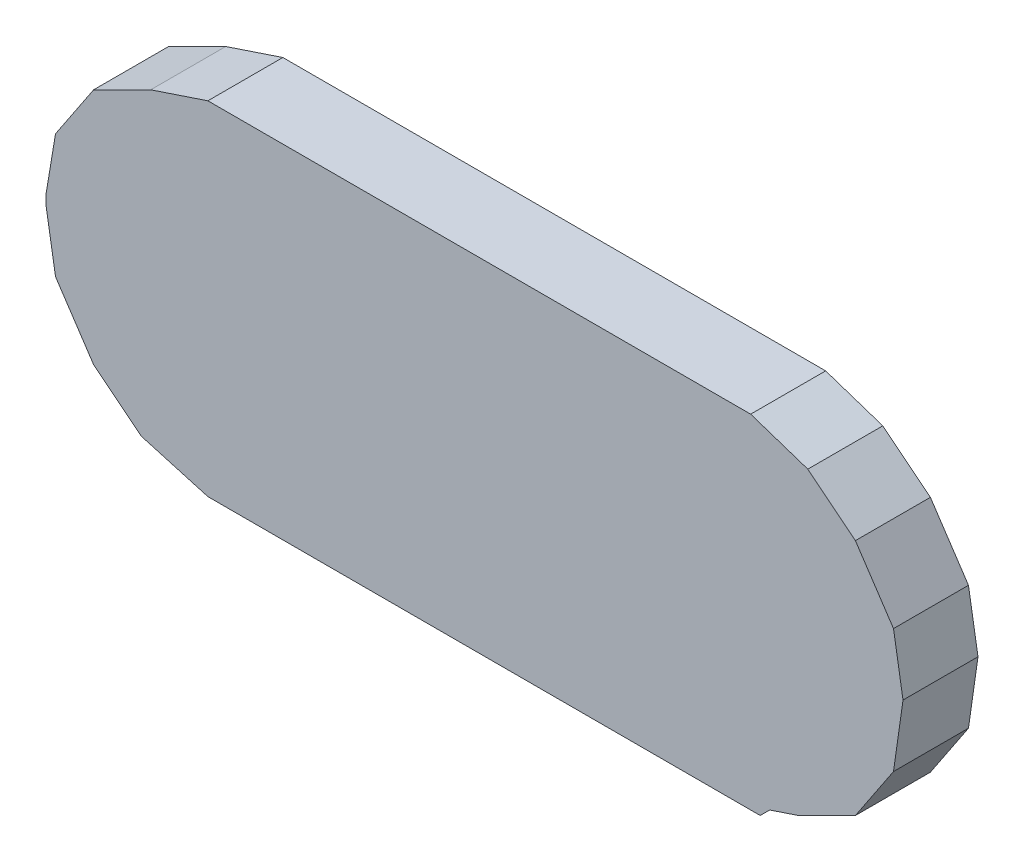
ISO-10303-21;
HEADER;
FILE_DESCRIPTION(('STEP AP214'),'2;1');
FILE_NAME('part.step','',(''),(''),'','','');
FILE_SCHEMA(('AUTOMOTIVE_DESIGN { 1 0 10303 214 1 1 1 1 }'));
ENDSEC;
DATA;
#1=APPLICATION_CONTEXT('core data for automotive mechanical design processes');
#2=APPLICATION_PROTOCOL_DEFINITION('international standard','automotive_design',2000,#1);
#3=PRODUCT_CONTEXT('',#1,'mechanical');
#4=PRODUCT('Part','Part','',(#3));
#5=PRODUCT_RELATED_PRODUCT_CATEGORY('part','',(#4));
#6=PRODUCT_DEFINITION_FORMATION('','',#4);
#7=PRODUCT_DEFINITION_CONTEXT('part definition',#1,'design');
#8=PRODUCT_DEFINITION('design','',#6,#7);
#9=PRODUCT_DEFINITION_SHAPE('','',#8);
#10=(LENGTH_UNIT() NAMED_UNIT(*) SI_UNIT(.MILLI.,.METRE.));
#11=(NAMED_UNIT(*) PLANE_ANGLE_UNIT() SI_UNIT($,.RADIAN.));
#12=(NAMED_UNIT(*) SI_UNIT($,.STERADIAN.) SOLID_ANGLE_UNIT());
#13=UNCERTAINTY_MEASURE_WITH_UNIT(LENGTH_MEASURE(1.E-05),#10,'distance_accuracy_value','');
#14=(GEOMETRIC_REPRESENTATION_CONTEXT(3) GLOBAL_UNCERTAINTY_ASSIGNED_CONTEXT((#13)) GLOBAL_UNIT_ASSIGNED_CONTEXT((#10,
#11,#12)) REPRESENTATION_CONTEXT('',''));
#15=CARTESIAN_POINT('',(0.,0.,0.));
#16=DIRECTION('',(0.,0.,1.));
#17=DIRECTION('',(1.,0.,0.));
#18=AXIS2_PLACEMENT_3D('',#15,#16,#17);
#19=CARTESIAN_POINT('',(-3.556,-2.286,1.));
#20=DIRECTION('',(0.,0.,-1.));
#21=DIRECTION('',(-1.,0.,0.));
#22=AXIS2_PLACEMENT_3D('',#19,#20,#21);
#23=PLANE('',#22);
#24=DIRECTION('',(-0.707106781186548,-0.707106781186548,0.));
#25=VECTOR('',#24,1.);
#26=CARTESIAN_POINT('',(3.81,-2.286,1.));
#27=LINE('',#26,#25);
#28=CARTESIAN_POINT('',(3.81,-2.286,1.));
#29=VERTEX_POINT('',#28);
#30=CARTESIAN_POINT('',(3.937,-2.159,1.));
#31=VERTEX_POINT('',#30);
#32=EDGE_CURVE('E236',#29,#31,#27,.F.);
#33=ORIENTED_EDGE('',*,*,#32,.T.);
#34=DIRECTION('',(-0.948683298050514,-0.316227766016838,0.));
#35=VECTOR('',#34,1.);
#36=CARTESIAN_POINT('',(3.937,-2.159,1.));
#37=LINE('',#36,#35);
#38=CARTESIAN_POINT('',(4.318,-2.032,1.));
#39=VERTEX_POINT('',#38);
#40=EDGE_CURVE('E232',#31,#39,#37,.F.);
#41=ORIENTED_EDGE('',*,*,#40,.T.);
#42=DIRECTION('',(-0.894427190999916,-0.447213595499958,0.));
#43=VECTOR('',#42,1.);
#44=CARTESIAN_POINT('',(4.318,-2.032,1.));
#45=LINE('',#44,#43);
#46=CARTESIAN_POINT('',(5.08,-1.651,1.));
#47=VERTEX_POINT('',#46);
#48=EDGE_CURVE('E228',#39,#47,#45,.F.);
#49=ORIENTED_EDGE('',*,*,#48,.T.);
#50=DIRECTION('',(-0.554700196224998,-0.832050294337997,0.));
#51=VECTOR('',#50,1.);
#52=CARTESIAN_POINT('',(5.08,-1.651,1.));
#53=LINE('',#52,#51);
#54=CARTESIAN_POINT('',(5.58799999999995,-0.888999999999965,1.));
#55=VERTEX_POINT('',#54);
#56=EDGE_CURVE('E224',#47,#55,#53,.F.);
#57=ORIENTED_EDGE('',*,*,#56,.T.);
#58=DIRECTION('',(-0.14142135623703,-0.989949493661207,0.));
#59=VECTOR('',#58,1.);
#60=CARTESIAN_POINT('',(5.588,-0.889,1.));
#61=LINE('',#60,#59);
#62=CARTESIAN_POINT('',(5.71499999999994,0.,1.));
#63=VERTEX_POINT('',#62);
#64=EDGE_CURVE('E220',#55,#63,#61,.F.);
#65=ORIENTED_EDGE('',*,*,#64,.T.);
#66=DIRECTION('',(0.164398987305033,-0.986393923832198,0.));
#67=VECTOR('',#66,1.);
#68=CARTESIAN_POINT('',(5.715,0.,1.));
#69=LINE('',#68,#67);
#70=CARTESIAN_POINT('',(5.58800000000006,0.76200000000001,1.));
#71=VERTEX_POINT('',#70);
#72=EDGE_CURVE('E216',#63,#71,#69,.F.);
#73=ORIENTED_EDGE('',*,*,#72,.T.);
#74=DIRECTION('',(0.554700196224998,-0.832050294337997,0.));
#75=VECTOR('',#74,1.);
#76=CARTESIAN_POINT('',(5.588,0.762,1.));
#77=LINE('',#76,#75);
#78=CARTESIAN_POINT('',(5.08000000000005,1.52400000000003,1.));
#79=VERTEX_POINT('',#78);
#80=EDGE_CURVE('E212',#71,#79,#77,.F.);
#81=ORIENTED_EDGE('',*,*,#80,.T.);
#82=DIRECTION('',(0.780868809443225,-0.62469504755418,0.));
#83=VECTOR('',#82,1.);
#84=CARTESIAN_POINT('',(5.08,1.524,1.));
#85=LINE('',#84,#83);
#86=CARTESIAN_POINT('',(4.44499999999996,2.03199999999995,1.));
#87=VERTEX_POINT('',#86);
#88=EDGE_CURVE('E208',#79,#87,#85,.F.);
#89=ORIENTED_EDGE('',*,*,#88,.T.);
#90=DIRECTION('',(0.948683298050514,-0.316227766016838,0.));
#91=VECTOR('',#90,1.);
#92=CARTESIAN_POINT('',(4.445,2.032,1.));
#93=LINE('',#92,#91);
#94=CARTESIAN_POINT('',(3.68300000000001,2.286,1.));
#95=VERTEX_POINT('',#94);
#96=EDGE_CURVE('E204',#87,#95,#93,.F.);
#97=ORIENTED_EDGE('',*,*,#96,.T.);
#98=DIRECTION('',(1.,0.,0.));
#99=VECTOR('',#98,1.);
#100=CARTESIAN_POINT('',(3.683,2.286,1.));
#101=LINE('',#100,#99);
#102=CARTESIAN_POINT('',(-3.556,2.286,1.));
#103=VERTEX_POINT('',#102);
#104=EDGE_CURVE('E200',#95,#103,#101,.F.);
#105=ORIENTED_EDGE('',*,*,#104,.T.);
#106=DIRECTION('',(0.948683298050514,0.316227766016838,0.));
#107=VECTOR('',#106,1.);
#108=CARTESIAN_POINT('',(-3.556,2.286,1.));
#109=LINE('',#108,#107);
#110=CARTESIAN_POINT('',(-4.318,2.032,1.));
#111=VERTEX_POINT('',#110);
#112=EDGE_CURVE('E196',#103,#111,#109,.F.);
#113=ORIENTED_EDGE('',*,*,#112,.T.);
#114=DIRECTION('',(0.894427190999916,0.447213595499958,0.));
#115=VECTOR('',#114,1.);
#116=CARTESIAN_POINT('',(-4.318,2.032,1.));
#117=LINE('',#116,#115);
#118=CARTESIAN_POINT('',(-5.08,1.651,1.));
#119=VERTEX_POINT('',#118);
#120=EDGE_CURVE('E192',#111,#119,#117,.F.);
#121=ORIENTED_EDGE('',*,*,#120,.T.);
#122=DIRECTION('',(0.554700196224998,0.832050294337997,0.));
#123=VECTOR('',#122,1.);
#124=CARTESIAN_POINT('',(-5.08,1.651,1.));
#125=LINE('',#124,#123);
#126=CARTESIAN_POINT('',(-5.58799999999995,0.888999999999966,1.));
#127=VERTEX_POINT('',#126);
#128=EDGE_CURVE('E188',#119,#127,#125,.F.);
#129=ORIENTED_EDGE('',*,*,#128,.T.);
#130=DIRECTION('',(0.164398987305033,0.986393923832198,0.));
#131=VECTOR('',#130,1.);
#132=CARTESIAN_POINT('',(-5.588,0.889,1.));
#133=LINE('',#132,#131);
#134=CARTESIAN_POINT('',(-5.71499999999994,0.127,1.));
#135=VERTEX_POINT('',#134);
#136=EDGE_CURVE('E184',#127,#135,#133,.F.);
#137=ORIENTED_EDGE('',*,*,#136,.T.);
#138=DIRECTION('',(0.,1.,0.));
#139=VECTOR('',#138,1.);
#140=CARTESIAN_POINT('',(-5.715,0.127,1.));
#141=LINE('',#140,#139);
#142=CARTESIAN_POINT('',(-5.715,0.,1.));
#143=VERTEX_POINT('',#142);
#144=EDGE_CURVE('E180',#135,#143,#141,.F.);
#145=ORIENTED_EDGE('',*,*,#144,.T.);
#146=DIRECTION('',(-0.164398987305033,0.986393923832198,0.));
#147=VECTOR('',#146,1.);
#148=CARTESIAN_POINT('',(-5.715,0.,1.));
#149=LINE('',#148,#147);
#150=CARTESIAN_POINT('',(-5.58800000000006,-0.76200000000001,1.));
#151=VERTEX_POINT('',#150);
#152=EDGE_CURVE('E176',#143,#151,#149,.F.);
#153=ORIENTED_EDGE('',*,*,#152,.T.);
#154=DIRECTION('',(-0.554700196224998,0.832050294337997,0.));
#155=VECTOR('',#154,1.);
#156=CARTESIAN_POINT('',(-5.588,-0.762,1.));
#157=LINE('',#156,#155);
#158=CARTESIAN_POINT('',(-5.08000000000005,-1.52400000000003,1.));
#159=VERTEX_POINT('',#158);
#160=EDGE_CURVE('E152',#151,#159,#157,.F.);
#161=ORIENTED_EDGE('',*,*,#160,.T.);
#162=DIRECTION('',(-0.780868809443225,0.62469504755418,0.));
#163=VECTOR('',#162,1.);
#164=CARTESIAN_POINT('',(-5.08,-1.524,1.));
#165=LINE('',#164,#163);
#166=CARTESIAN_POINT('',(-4.44499999999996,-2.03199999999995,1.));
#167=VERTEX_POINT('',#166);
#168=EDGE_CURVE('E154',#159,#167,#165,.F.);
#169=ORIENTED_EDGE('',*,*,#168,.T.);
#170=DIRECTION('',(-0.961523947640936,0.274721127896982,0.));
#171=VECTOR('',#170,1.);
#172=CARTESIAN_POINT('',(-4.445,-2.032,1.));
#173=LINE('',#172,#171);
#174=CARTESIAN_POINT('',(-3.55599999999995,-2.28599999999982,1.));
#175=VERTEX_POINT('',#174);
#176=EDGE_CURVE('E20',#167,#175,#173,.F.);
#177=ORIENTED_EDGE('',*,*,#176,.T.);
#178=DIRECTION('',(1.,0.,0.));
#179=VECTOR('',#178,1.);
#180=CARTESIAN_POINT('',(-3.556,-2.286,1.));
#181=LINE('',#180,#179);
#182=EDGE_CURVE('E241',#175,#29,#181,.T.);
#183=ORIENTED_EDGE('',*,*,#182,.T.);
#184=EDGE_LOOP('',(#33,#41,#49,#57,#65,#73,#81,#89,#97,#105,#113,#121,#129,#137,#145,#153,#161,
#169,#177,#183));
#185=FACE_BOUND('',#184,.T.);
#186=ADVANCED_FACE('F17',(#185),#23,.F.);
#187=CARTESIAN_POINT('',(-4.445,-2.032,0.));
#188=DIRECTION('',(0.274721127896982,0.961523947640936,0.));
#189=DIRECTION('',(-0.961523947640936,0.274721127896982,0.));
#190=AXIS2_PLACEMENT_3D('',#187,#188,#189);
#191=PLANE('',#190);
#192=DIRECTION('',(0.,0.,1.));
#193=VECTOR('',#192,1.);
#194=CARTESIAN_POINT('',(-3.556,-2.286,0.));
#195=LINE('',#194,#193);
#196=CARTESIAN_POINT('',(-3.55599999999995,-2.28599999999982,0.));
#197=VERTEX_POINT('',#196);
#198=EDGE_CURVE('E165',#197,#175,#195,.T.);
#199=ORIENTED_EDGE('',*,*,#198,.T.);
#200=ORIENTED_EDGE('',*,*,#176,.F.);
#201=DIRECTION('',(0.,0.,1.));
#202=VECTOR('',#201,1.);
#203=CARTESIAN_POINT('',(-4.44499999999984,-2.0319999999998,0.));
#204=LINE('',#203,#202);
#205=CARTESIAN_POINT('',(-4.44499999999996,-2.03199999999995,0.));
#206=VERTEX_POINT('',#205);
#207=EDGE_CURVE('E160',#167,#206,#204,.F.);
#208=ORIENTED_EDGE('',*,*,#207,.T.);
#209=DIRECTION('',(-0.961523947640823,0.274721127897378,0.));
#210=VECTOR('',#209,1.);
#211=CARTESIAN_POINT('',(-3.556,-2.286,0.));
#212=LINE('',#211,#210);
#213=EDGE_CURVE('E244',#197,#206,#212,.T.);
#214=ORIENTED_EDGE('',*,*,#213,.F.);
#215=EDGE_LOOP('',(#199,#200,#208,#214));
#216=FACE_BOUND('',#215,.T.);
#217=ADVANCED_FACE('F162',(#216),#191,.F.);
#218=CARTESIAN_POINT('',(-5.08,-1.524,0.));
#219=DIRECTION('',(0.62469504755418,0.780868809443225,0.));
#220=DIRECTION('',(-0.780868809443225,0.62469504755418,0.));
#221=AXIS2_PLACEMENT_3D('',#218,#219,#220);
#222=PLANE('',#221);
#223=ORIENTED_EDGE('',*,*,#207,.F.);
#224=ORIENTED_EDGE('',*,*,#168,.F.);
#225=DIRECTION('',(0.,0.,1.));
#226=VECTOR('',#225,1.);
#227=CARTESIAN_POINT('',(-5.08000000000021,-1.52400000000014,0.));
#228=LINE('',#227,#226);
#229=CARTESIAN_POINT('',(-5.08000000000005,-1.52400000000003,0.));
#230=VERTEX_POINT('',#229);
#231=EDGE_CURVE('E172',#159,#230,#228,.F.);
#232=ORIENTED_EDGE('',*,*,#231,.T.);
#233=DIRECTION('',(-0.78086880944303,0.624695047554424,0.));
#234=VECTOR('',#233,1.);
#235=CARTESIAN_POINT('',(-4.445,-2.032,0.));
#236=LINE('',#235,#234);
#237=EDGE_CURVE('E169',#206,#230,#236,.T.);
#238=ORIENTED_EDGE('',*,*,#237,.F.);
#239=EDGE_LOOP('',(#223,#224,#232,#238));
#240=FACE_BOUND('',#239,.T.);
#241=ADVANCED_FACE('F167',(#240),#222,.F.);
#242=CARTESIAN_POINT('',(-5.588,-0.762,0.));
#243=DIRECTION('',(0.832050294337997,0.554700196224998,0.));
#244=DIRECTION('',(-0.554700196224998,0.832050294337997,0.));
#245=AXIS2_PLACEMENT_3D('',#242,#243,#244);
#246=PLANE('',#245);
#247=ORIENTED_EDGE('',*,*,#231,.F.);
#248=ORIENTED_EDGE('',*,*,#160,.F.);
#249=DIRECTION('',(0.,0.,1.));
#250=VECTOR('',#249,1.);
#251=CARTESIAN_POINT('',(-5.58800000000025,-0.762000000000042,0.));
#252=LINE('',#251,#250);
#253=CARTESIAN_POINT('',(-5.58800000000006,-0.76200000000001,0.));
#254=VERTEX_POINT('',#253);
#255=EDGE_CURVE('E178',#151,#254,#252,.F.);
#256=ORIENTED_EDGE('',*,*,#255,.T.);
#257=DIRECTION('',(-0.554700196225229,0.832050294337844,0.));
#258=VECTOR('',#257,1.);
#259=CARTESIAN_POINT('',(-5.08,-1.524,0.));
#260=LINE('',#259,#258);
#261=EDGE_CURVE('E247',#230,#254,#260,.T.);
#262=ORIENTED_EDGE('',*,*,#261,.F.);
#263=EDGE_LOOP('',(#247,#248,#256,#262));
#264=FACE_BOUND('',#263,.T.);
#265=ADVANCED_FACE('F376',(#264),#246,.F.);
#266=CARTESIAN_POINT('',(-5.715,0.,0.));
#267=DIRECTION('',(0.986393923832198,0.164398987305033,0.));
#268=DIRECTION('',(-0.164398987305033,0.986393923832198,0.));
#269=AXIS2_PLACEMENT_3D('',#266,#267,#268);
#270=PLANE('',#269);
#271=ORIENTED_EDGE('',*,*,#255,.F.);
#272=ORIENTED_EDGE('',*,*,#152,.F.);
#273=DIRECTION('',(0.,0.,-1.));
#274=VECTOR('',#273,1.);
#275=CARTESIAN_POINT('',(-5.715,0.,0.));
#276=LINE('',#275,#274);
#277=CARTESIAN_POINT('',(-5.715,0.,0.));
#278=VERTEX_POINT('',#277);
#279=EDGE_CURVE('E182',#143,#278,#276,.T.);
#280=ORIENTED_EDGE('',*,*,#279,.T.);
#281=DIRECTION('',(-0.164398987305357,0.986393923832144,0.));
#282=VECTOR('',#281,1.);
#283=CARTESIAN_POINT('',(-5.588,-0.762,0.));
#284=LINE('',#283,#282);
#285=EDGE_CURVE('E250',#254,#278,#284,.T.);
#286=ORIENTED_EDGE('',*,*,#285,.F.);
#287=EDGE_LOOP('',(#271,#272,#280,#286));
#288=FACE_BOUND('',#287,.T.);
#289=ADVANCED_FACE('F374',(#288),#270,.F.);
#290=CARTESIAN_POINT('',(-5.715,0.127,0.));
#291=DIRECTION('',(1.,0.,0.));
#292=DIRECTION('',(0.,0.,-1.));
#293=AXIS2_PLACEMENT_3D('',#290,#291,#292);
#294=PLANE('',#293);
#295=ORIENTED_EDGE('',*,*,#279,.F.);
#296=ORIENTED_EDGE('',*,*,#144,.F.);
#297=DIRECTION('',(0.,0.,1.));
#298=VECTOR('',#297,1.);
#299=CARTESIAN_POINT('',(-5.71499999999975,0.126999999999958,0.));
#300=LINE('',#299,#298);
#301=CARTESIAN_POINT('',(-5.71499999999994,0.126999999999995,0.));
#302=VERTEX_POINT('',#301);
#303=EDGE_CURVE('E186',#135,#302,#300,.F.);
#304=ORIENTED_EDGE('',*,*,#303,.T.);
#305=DIRECTION('',(0.,1.,0.));
#306=VECTOR('',#305,1.);
#307=CARTESIAN_POINT('',(-5.715,-2.286,0.));
#308=LINE('',#307,#306);
#309=EDGE_CURVE('E253',#278,#302,#308,.T.);
#310=ORIENTED_EDGE('',*,*,#309,.F.);
#311=EDGE_LOOP('',(#295,#296,#304,#310));
#312=FACE_BOUND('',#311,.T.);
#313=ADVANCED_FACE('F369',(#312),#294,.F.);
#314=CARTESIAN_POINT('',(-5.588,0.889,0.));
#315=DIRECTION('',(0.986393923832198,-0.164398987305033,0.));
#316=DIRECTION('',(0.164398987305033,0.986393923832198,0.));
#317=AXIS2_PLACEMENT_3D('',#314,#315,#316);
#318=PLANE('',#317);
#319=ORIENTED_EDGE('',*,*,#303,.F.);
#320=ORIENTED_EDGE('',*,*,#136,.F.);
#321=DIRECTION('',(0.,0.,1.));
#322=VECTOR('',#321,1.);
#323=CARTESIAN_POINT('',(-5.58799999999979,0.888999999999859,0.));
#324=LINE('',#323,#322);
#325=CARTESIAN_POINT('',(-5.58799999999995,0.888999999999965,0.));
#326=VERTEX_POINT('',#325);
#327=EDGE_CURVE('E190',#127,#326,#324,.F.);
#328=ORIENTED_EDGE('',*,*,#327,.T.);
#329=DIRECTION('',(0.164398987305357,0.986393923832144,0.));
#330=VECTOR('',#329,1.);
#331=CARTESIAN_POINT('',(-5.715,0.127,0.));
#332=LINE('',#331,#330);
#333=EDGE_CURVE('E256',#302,#326,#332,.T.);
#334=ORIENTED_EDGE('',*,*,#333,.F.);
#335=EDGE_LOOP('',(#319,#320,#328,#334));
#336=FACE_BOUND('',#335,.T.);
#337=ADVANCED_FACE('F364',(#336),#318,.F.);
#338=CARTESIAN_POINT('',(-5.08,1.651,0.));
#339=DIRECTION('',(0.832050294337997,-0.554700196224998,0.));
#340=DIRECTION('',(0.554700196224998,0.832050294337997,0.));
#341=AXIS2_PLACEMENT_3D('',#338,#339,#340);
#342=PLANE('',#341);
#343=ORIENTED_EDGE('',*,*,#327,.F.);
#344=ORIENTED_EDGE('',*,*,#128,.F.);
#345=DIRECTION('',(0.,0.,1.));
#346=VECTOR('',#345,1.);
#347=CARTESIAN_POINT('',(-5.08,1.651,0.));
#348=LINE('',#347,#346);
#349=CARTESIAN_POINT('',(-5.08,1.651,0.));
#350=VERTEX_POINT('',#349);
#351=EDGE_CURVE('E194',#119,#350,#348,.F.);
#352=ORIENTED_EDGE('',*,*,#351,.T.);
#353=DIRECTION('',(0.554700196225229,0.832050294337844,0.));
#354=VECTOR('',#353,1.);
#355=CARTESIAN_POINT('',(-5.588,0.889,0.));
#356=LINE('',#355,#354);
#357=EDGE_CURVE('E259',#326,#350,#356,.T.);
#358=ORIENTED_EDGE('',*,*,#357,.F.);
#359=EDGE_LOOP('',(#343,#344,#352,#358));
#360=FACE_BOUND('',#359,.T.);
#361=ADVANCED_FACE('F359',(#360),#342,.F.);
#362=CARTESIAN_POINT('',(-4.318,2.032,0.));
#363=DIRECTION('',(0.447213595499958,-0.894427190999916,0.));
#364=DIRECTION('',(0.894427190999916,0.447213595499958,0.));
#365=AXIS2_PLACEMENT_3D('',#362,#363,#364);
#366=PLANE('',#365);
#367=ORIENTED_EDGE('',*,*,#351,.F.);
#368=ORIENTED_EDGE('',*,*,#120,.F.);
#369=DIRECTION('',(0.,0.,1.));
#370=VECTOR('',#369,1.);
#371=CARTESIAN_POINT('',(-4.318,2.032,0.));
#372=LINE('',#371,#370);
#373=CARTESIAN_POINT('',(-4.318,2.032,0.));
#374=VERTEX_POINT('',#373);
#375=EDGE_CURVE('E198',#111,#374,#372,.F.);
#376=ORIENTED_EDGE('',*,*,#375,.T.);
#377=DIRECTION('',(0.894427190999916,0.447213595499958,0.));
#378=VECTOR('',#377,1.);
#379=CARTESIAN_POINT('',(-5.08,1.651,0.));
#380=LINE('',#379,#378);
#381=EDGE_CURVE('E262',#350,#374,#380,.T.);
#382=ORIENTED_EDGE('',*,*,#381,.F.);
#383=EDGE_LOOP('',(#367,#368,#376,#382));
#384=FACE_BOUND('',#383,.T.);
#385=ADVANCED_FACE('F354',(#384),#366,.F.);
#386=CARTESIAN_POINT('',(-3.556,2.286,0.));
#387=DIRECTION('',(0.316227766016838,-0.948683298050514,0.));
#388=DIRECTION('',(0.948683298050514,0.316227766016838,0.));
#389=AXIS2_PLACEMENT_3D('',#386,#387,#388);
#390=PLANE('',#389);
#391=ORIENTED_EDGE('',*,*,#375,.F.);
#392=ORIENTED_EDGE('',*,*,#112,.F.);
#393=DIRECTION('',(0.,0.,-1.));
#394=VECTOR('',#393,1.);
#395=CARTESIAN_POINT('',(-3.556,2.286,0.));
#396=LINE('',#395,#394);
#397=CARTESIAN_POINT('',(-3.556,2.286,0.));
#398=VERTEX_POINT('',#397);
#399=EDGE_CURVE('E202',#103,#398,#396,.T.);
#400=ORIENTED_EDGE('',*,*,#399,.T.);
#401=DIRECTION('',(0.948683298050514,0.316227766016838,0.));
#402=VECTOR('',#401,1.);
#403=CARTESIAN_POINT('',(-4.318,2.032,0.));
#404=LINE('',#403,#402);
#405=EDGE_CURVE('E265',#374,#398,#404,.T.);
#406=ORIENTED_EDGE('',*,*,#405,.F.);
#407=EDGE_LOOP('',(#391,#392,#400,#406));
#408=FACE_BOUND('',#407,.T.);
#409=ADVANCED_FACE('F349',(#408),#390,.F.);
#410=CARTESIAN_POINT('',(3.683,2.286,0.));
#411=DIRECTION('',(0.,-1.,0.));
#412=DIRECTION('',(0.,0.,-1.));
#413=AXIS2_PLACEMENT_3D('',#410,#411,#412);
#414=PLANE('',#413);
#415=ORIENTED_EDGE('',*,*,#399,.F.);
#416=ORIENTED_EDGE('',*,*,#104,.F.);
#417=DIRECTION('',(0.,0.,1.));
#418=VECTOR('',#417,1.);
#419=CARTESIAN_POINT('',(3.683,2.286,0.));
#420=LINE('',#419,#418);
#421=CARTESIAN_POINT('',(3.68300000000001,2.286,0.));
#422=VERTEX_POINT('',#421);
#423=EDGE_CURVE('E206',#95,#422,#420,.F.);
#424=ORIENTED_EDGE('',*,*,#423,.T.);
#425=DIRECTION('',(-1.,0.,0.));
#426=VECTOR('',#425,1.);
#427=CARTESIAN_POINT('',(-3.556,2.286,0.));
#428=LINE('',#427,#426);
#429=EDGE_CURVE('E268',#398,#422,#428,.F.);
#430=ORIENTED_EDGE('',*,*,#429,.F.);
#431=EDGE_LOOP('',(#415,#416,#424,#430));
#432=FACE_BOUND('',#431,.T.);
#433=ADVANCED_FACE('F344',(#432),#414,.F.);
#434=CARTESIAN_POINT('',(4.445,2.032,0.));
#435=DIRECTION('',(-0.316227766016838,-0.948683298050514,0.));
#436=DIRECTION('',(0.948683298050514,-0.316227766016838,0.));
#437=AXIS2_PLACEMENT_3D('',#434,#435,#436);
#438=PLANE('',#437);
#439=ORIENTED_EDGE('',*,*,#423,.F.);
#440=ORIENTED_EDGE('',*,*,#96,.F.);
#441=DIRECTION('',(0.,0.,1.));
#442=VECTOR('',#441,1.);
#443=CARTESIAN_POINT('',(4.44499999999984,2.0319999999998,0.));
#444=LINE('',#443,#442);
#445=CARTESIAN_POINT('',(4.44499999999996,2.03199999999995,0.));
#446=VERTEX_POINT('',#445);
#447=EDGE_CURVE('E210',#87,#446,#444,.F.);
#448=ORIENTED_EDGE('',*,*,#447,.T.);
#449=DIRECTION('',(0.948683298050514,-0.316227766016838,0.));
#450=VECTOR('',#449,1.);
#451=CARTESIAN_POINT('',(3.683,2.286,0.));
#452=LINE('',#451,#450);
#453=EDGE_CURVE('E271',#422,#446,#452,.T.);
#454=ORIENTED_EDGE('',*,*,#453,.F.);
#455=EDGE_LOOP('',(#439,#440,#448,#454));
#456=FACE_BOUND('',#455,.T.);
#457=ADVANCED_FACE('F339',(#456),#438,.F.);
#458=CARTESIAN_POINT('',(5.08,1.524,0.));
#459=DIRECTION('',(-0.62469504755418,-0.780868809443225,0.));
#460=DIRECTION('',(0.780868809443225,-0.62469504755418,0.));
#461=AXIS2_PLACEMENT_3D('',#458,#459,#460);
#462=PLANE('',#461);
#463=ORIENTED_EDGE('',*,*,#447,.F.);
#464=ORIENTED_EDGE('',*,*,#88,.F.);
#465=DIRECTION('',(0.,0.,1.));
#466=VECTOR('',#465,1.);
#467=CARTESIAN_POINT('',(5.08000000000021,1.52400000000014,0.));
#468=LINE('',#467,#466);
#469=CARTESIAN_POINT('',(5.08000000000005,1.52400000000003,0.));
#470=VERTEX_POINT('',#469);
#471=EDGE_CURVE('E214',#79,#470,#468,.F.);
#472=ORIENTED_EDGE('',*,*,#471,.T.);
#473=DIRECTION('',(0.78086880944303,-0.624695047554425,0.));
#474=VECTOR('',#473,1.);
#475=CARTESIAN_POINT('',(4.445,2.032,0.));
#476=LINE('',#475,#474);
#477=EDGE_CURVE('E274',#446,#470,#476,.T.);
#478=ORIENTED_EDGE('',*,*,#477,.F.);
#479=EDGE_LOOP('',(#463,#464,#472,#478));
#480=FACE_BOUND('',#479,.T.);
#481=ADVANCED_FACE('F334',(#480),#462,.F.);
#482=CARTESIAN_POINT('',(5.588,0.762,0.));
#483=DIRECTION('',(-0.832050294337997,-0.554700196224998,0.));
#484=DIRECTION('',(0.554700196224998,-0.832050294337997,0.));
#485=AXIS2_PLACEMENT_3D('',#482,#483,#484);
#486=PLANE('',#485);
#487=ORIENTED_EDGE('',*,*,#471,.F.);
#488=ORIENTED_EDGE('',*,*,#80,.F.);
#489=DIRECTION('',(0.,0.,1.));
#490=VECTOR('',#489,1.);
#491=CARTESIAN_POINT('',(5.58800000000025,0.762000000000042,0.));
#492=LINE('',#491,#490);
#493=CARTESIAN_POINT('',(5.58800000000006,0.76200000000001,0.));
#494=VERTEX_POINT('',#493);
#495=EDGE_CURVE('E218',#71,#494,#492,.F.);
#496=ORIENTED_EDGE('',*,*,#495,.T.);
#497=DIRECTION('',(0.554700196225228,-0.832050294337844,0.));
#498=VECTOR('',#497,1.);
#499=CARTESIAN_POINT('',(5.08,1.524,0.));
#500=LINE('',#499,#498);
#501=EDGE_CURVE('E277',#470,#494,#500,.T.);
#502=ORIENTED_EDGE('',*,*,#501,.F.);
#503=EDGE_LOOP('',(#487,#488,#496,#502));
#504=FACE_BOUND('',#503,.T.);
#505=ADVANCED_FACE('F329',(#504),#486,.F.);
#506=CARTESIAN_POINT('',(5.715,0.,0.));
#507=DIRECTION('',(-0.986393923832198,-0.164398987305033,0.));
#508=DIRECTION('',(0.164398987305033,-0.986393923832198,0.));
#509=AXIS2_PLACEMENT_3D('',#506,#507,#508);
#510=PLANE('',#509);
#511=ORIENTED_EDGE('',*,*,#495,.F.);
#512=ORIENTED_EDGE('',*,*,#72,.F.);
#513=DIRECTION('',(0.,0.,1.));
#514=VECTOR('',#513,1.);
#515=CARTESIAN_POINT('',(5.71499999999975,0.,0.));
#516=LINE('',#515,#514);
#517=CARTESIAN_POINT('',(5.71499999999994,0.,0.));
#518=VERTEX_POINT('',#517);
#519=EDGE_CURVE('E222',#63,#518,#516,.F.);
#520=ORIENTED_EDGE('',*,*,#519,.T.);
#521=DIRECTION('',(0.164398987305358,-0.986393923832144,0.));
#522=VECTOR('',#521,1.);
#523=CARTESIAN_POINT('',(5.588,0.762,0.));
#524=LINE('',#523,#522);
#525=EDGE_CURVE('E280',#494,#518,#524,.T.);
#526=ORIENTED_EDGE('',*,*,#525,.F.);
#527=EDGE_LOOP('',(#511,#512,#520,#526));
#528=FACE_BOUND('',#527,.T.);
#529=ADVANCED_FACE('F324',(#528),#510,.F.);
#530=CARTESIAN_POINT('',(5.588,-0.889,0.));
#531=DIRECTION('',(-0.989949493661207,0.14142135623703,0.));
#532=DIRECTION('',(-0.14142135623703,-0.989949493661207,0.));
#533=AXIS2_PLACEMENT_3D('',#530,#531,#532);
#534=PLANE('',#533);
#535=ORIENTED_EDGE('',*,*,#519,.F.);
#536=ORIENTED_EDGE('',*,*,#64,.F.);
#537=DIRECTION('',(0.,0.,1.));
#538=VECTOR('',#537,1.);
#539=CARTESIAN_POINT('',(5.58799999999979,-0.888999999999859,0.));
#540=LINE('',#539,#538);
#541=CARTESIAN_POINT('',(5.58799999999995,-0.888999999999965,0.));
#542=VERTEX_POINT('',#541);
#543=EDGE_CURVE('E226',#55,#542,#540,.F.);
#544=ORIENTED_EDGE('',*,*,#543,.T.);
#545=DIRECTION('',(-0.14142135623731,-0.989949493661167,0.));
#546=VECTOR('',#545,1.);
#547=CARTESIAN_POINT('',(5.715,0.,0.));
#548=LINE('',#547,#546);
#549=EDGE_CURVE('E283',#518,#542,#548,.T.);
#550=ORIENTED_EDGE('',*,*,#549,.F.);
#551=EDGE_LOOP('',(#535,#536,#544,#550));
#552=FACE_BOUND('',#551,.T.);
#553=ADVANCED_FACE('F319',(#552),#534,.F.);
#554=CARTESIAN_POINT('',(5.08,-1.651,0.));
#555=DIRECTION('',(-0.832050294337997,0.554700196224998,0.));
#556=DIRECTION('',(-0.554700196224998,-0.832050294337997,0.));
#557=AXIS2_PLACEMENT_3D('',#554,#555,#556);
#558=PLANE('',#557);
#559=ORIENTED_EDGE('',*,*,#543,.F.);
#560=ORIENTED_EDGE('',*,*,#56,.F.);
#561=DIRECTION('',(0.,0.,1.));
#562=VECTOR('',#561,1.);
#563=CARTESIAN_POINT('',(5.08,-1.651,0.));
#564=LINE('',#563,#562);
#565=CARTESIAN_POINT('',(5.08,-1.651,0.));
#566=VERTEX_POINT('',#565);
#567=EDGE_CURVE('E230',#47,#566,#564,.F.);
#568=ORIENTED_EDGE('',*,*,#567,.T.);
#569=DIRECTION('',(-0.554700196225227,-0.832050294337845,0.));
#570=VECTOR('',#569,1.);
#571=CARTESIAN_POINT('',(5.588,-0.889,0.));
#572=LINE('',#571,#570);
#573=EDGE_CURVE('E286',#542,#566,#572,.T.);
#574=ORIENTED_EDGE('',*,*,#573,.F.);
#575=EDGE_LOOP('',(#559,#560,#568,#574));
#576=FACE_BOUND('',#575,.T.);
#577=ADVANCED_FACE('F314',(#576),#558,.F.);
#578=CARTESIAN_POINT('',(4.318,-2.032,0.));
#579=DIRECTION('',(-0.447213595499958,0.894427190999916,0.));
#580=DIRECTION('',(-0.894427190999916,-0.447213595499958,0.));
#581=AXIS2_PLACEMENT_3D('',#578,#579,#580);
#582=PLANE('',#581);
#583=ORIENTED_EDGE('',*,*,#567,.F.);
#584=ORIENTED_EDGE('',*,*,#48,.F.);
#585=DIRECTION('',(0.,0.,1.));
#586=VECTOR('',#585,1.);
#587=CARTESIAN_POINT('',(4.318,-2.032,0.));
#588=LINE('',#587,#586);
#589=CARTESIAN_POINT('',(4.318,-2.032,0.));
#590=VERTEX_POINT('',#589);
#591=EDGE_CURVE('E234',#39,#590,#588,.F.);
#592=ORIENTED_EDGE('',*,*,#591,.T.);
#593=DIRECTION('',(-0.894427190999917,-0.447213595499957,0.));
#594=VECTOR('',#593,1.);
#595=CARTESIAN_POINT('',(5.08,-1.651,0.));
#596=LINE('',#595,#594);
#597=EDGE_CURVE('E289',#566,#590,#596,.T.);
#598=ORIENTED_EDGE('',*,*,#597,.F.);
#599=EDGE_LOOP('',(#583,#584,#592,#598));
#600=FACE_BOUND('',#599,.T.);
#601=ADVANCED_FACE('F309',(#600),#582,.F.);
#602=CARTESIAN_POINT('',(3.937,-2.159,0.));
#603=DIRECTION('',(-0.316227766016838,0.948683298050514,0.));
#604=DIRECTION('',(-0.948683298050514,-0.316227766016838,0.));
#605=AXIS2_PLACEMENT_3D('',#602,#603,#604);
#606=PLANE('',#605);
#607=ORIENTED_EDGE('',*,*,#591,.F.);
#608=ORIENTED_EDGE('',*,*,#40,.F.);
#609=DIRECTION('',(0.,0.,1.));
#610=VECTOR('',#609,1.);
#611=CARTESIAN_POINT('',(3.937,-2.159,0.));
#612=LINE('',#611,#610);
#613=CARTESIAN_POINT('',(3.937,-2.159,0.));
#614=VERTEX_POINT('',#613);
#615=EDGE_CURVE('E238',#31,#614,#612,.F.);
#616=ORIENTED_EDGE('',*,*,#615,.T.);
#617=DIRECTION('',(-0.948683298050514,-0.316227766016838,0.));
#618=VECTOR('',#617,1.);
#619=CARTESIAN_POINT('',(4.318,-2.032,0.));
#620=LINE('',#619,#618);
#621=EDGE_CURVE('E292',#590,#614,#620,.T.);
#622=ORIENTED_EDGE('',*,*,#621,.F.);
#623=EDGE_LOOP('',(#607,#608,#616,#622));
#624=FACE_BOUND('',#623,.T.);
#625=ADVANCED_FACE('F304',(#624),#606,.F.);
#626=CARTESIAN_POINT('',(3.81,-2.286,0.));
#627=DIRECTION('',(-0.707106781186548,0.707106781186548,0.));
#628=DIRECTION('',(-0.707106781186548,-0.707106781186548,0.));
#629=AXIS2_PLACEMENT_3D('',#626,#627,#628);
#630=PLANE('',#629);
#631=ORIENTED_EDGE('',*,*,#615,.F.);
#632=ORIENTED_EDGE('',*,*,#32,.F.);
#633=DIRECTION('',(0.,0.,1.));
#634=VECTOR('',#633,1.);
#635=CARTESIAN_POINT('',(3.81,-2.286,0.));
#636=LINE('',#635,#634);
#637=CARTESIAN_POINT('',(3.81,-2.286,0.));
#638=VERTEX_POINT('',#637);
#639=EDGE_CURVE('E35',#29,#638,#636,.F.);
#640=ORIENTED_EDGE('',*,*,#639,.T.);
#641=DIRECTION('',(-0.707106781186545,-0.70710678118655,0.));
#642=VECTOR('',#641,1.);
#643=CARTESIAN_POINT('',(3.937,-2.159,0.));
#644=LINE('',#643,#642);
#645=EDGE_CURVE('E26',#614,#638,#644,.T.);
#646=ORIENTED_EDGE('',*,*,#645,.F.);
#647=EDGE_LOOP('',(#631,#632,#640,#646));
#648=FACE_BOUND('',#647,.T.);
#649=ADVANCED_FACE('F300',(#648),#630,.F.);
#650=CARTESIAN_POINT('',(-3.556,-2.286,0.));
#651=DIRECTION('',(0.,1.,0.));
#652=DIRECTION('',(0.,0.,1.));
#653=AXIS2_PLACEMENT_3D('',#650,#651,#652);
#654=PLANE('',#653);
#655=ORIENTED_EDGE('',*,*,#639,.F.);
#656=ORIENTED_EDGE('',*,*,#182,.F.);
#657=ORIENTED_EDGE('',*,*,#198,.F.);
#658=DIRECTION('',(-1.,0.,0.));
#659=VECTOR('',#658,1.);
#660=CARTESIAN_POINT('',(-3.556,-2.286,0.));
#661=LINE('',#660,#659);
#662=EDGE_CURVE('E11',#638,#197,#661,.T.);
#663=ORIENTED_EDGE('',*,*,#662,.F.);
#664=EDGE_LOOP('',(#655,#656,#657,#663));
#665=FACE_BOUND('',#664,.T.);
#666=ADVANCED_FACE('F379',(#665),#654,.F.);
#667=CARTESIAN_POINT('',(-3.556,-2.286,0.));
#668=DIRECTION('',(0.,0.,-1.));
#669=DIRECTION('',(-1.,0.,0.));
#670=AXIS2_PLACEMENT_3D('',#667,#668,#669);
#671=PLANE('',#670);
#672=ORIENTED_EDGE('',*,*,#645,.T.);
#673=ORIENTED_EDGE('',*,*,#662,.T.);
#674=ORIENTED_EDGE('',*,*,#213,.T.);
#675=ORIENTED_EDGE('',*,*,#237,.T.);
#676=ORIENTED_EDGE('',*,*,#261,.T.);
#677=ORIENTED_EDGE('',*,*,#285,.T.);
#678=ORIENTED_EDGE('',*,*,#309,.T.);
#679=ORIENTED_EDGE('',*,*,#333,.T.);
#680=ORIENTED_EDGE('',*,*,#357,.T.);
#681=ORIENTED_EDGE('',*,*,#381,.T.);
#682=ORIENTED_EDGE('',*,*,#405,.T.);
#683=ORIENTED_EDGE('',*,*,#429,.T.);
#684=ORIENTED_EDGE('',*,*,#453,.T.);
#685=ORIENTED_EDGE('',*,*,#477,.T.);
#686=ORIENTED_EDGE('',*,*,#501,.T.);
#687=ORIENTED_EDGE('',*,*,#525,.T.);
#688=ORIENTED_EDGE('',*,*,#549,.T.);
#689=ORIENTED_EDGE('',*,*,#573,.T.);
#690=ORIENTED_EDGE('',*,*,#597,.T.);
#691=ORIENTED_EDGE('',*,*,#621,.T.);
#692=EDGE_LOOP('',(#672,#673,#674,#675,#676,#677,#678,#679,#680,#681,#682,#683,#684,#685,#686,
#687,#688,#689,#690,#691));
#693=FACE_BOUND('',#692,.T.);
#694=ADVANCED_FACE('F297',(#693),#671,.T.);
#695=CLOSED_SHELL('',(#186,#217,#241,#265,#289,#313,#337,#361,#385,#409,#433,#457,#481,#505,
#529,#553,#577,#601,#625,#649,#666,#694));
#696=MANIFOLD_SOLID_BREP('B1',#695);
#697=ADVANCED_BREP_SHAPE_REPRESENTATION('',(#18,#696),#14);
#698=SHAPE_DEFINITION_REPRESENTATION(#9,#697);
ENDSEC;
END-ISO-10303-21;
